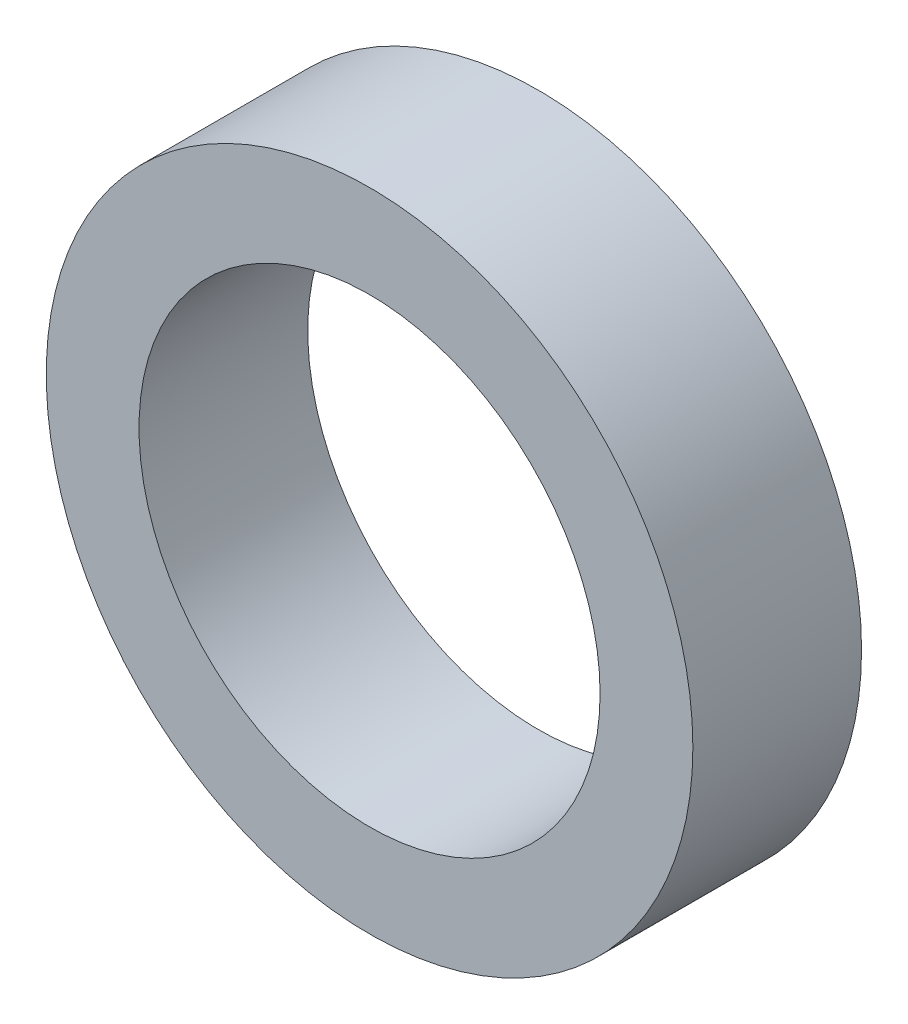
ISO-10303-21;
HEADER;
FILE_DESCRIPTION(('STEP AP214'),'2;1');
FILE_NAME('part.step','',(''),(''),'','','');
FILE_SCHEMA(('AUTOMOTIVE_DESIGN { 1 0 10303 214 1 1 1 1 }'));
ENDSEC;
DATA;
#1=APPLICATION_CONTEXT('core data for automotive mechanical design processes');
#2=APPLICATION_PROTOCOL_DEFINITION('international standard','automotive_design',2000,#1);
#3=PRODUCT_CONTEXT('',#1,'mechanical');
#4=PRODUCT('Part','Part','',(#3));
#5=PRODUCT_RELATED_PRODUCT_CATEGORY('part','',(#4));
#6=PRODUCT_DEFINITION_FORMATION('','',#4);
#7=PRODUCT_DEFINITION_CONTEXT('part definition',#1,'design');
#8=PRODUCT_DEFINITION('design','',#6,#7);
#9=PRODUCT_DEFINITION_SHAPE('','',#8);
#10=(LENGTH_UNIT() NAMED_UNIT(*) SI_UNIT(.MILLI.,.METRE.));
#11=(NAMED_UNIT(*) PLANE_ANGLE_UNIT() SI_UNIT($,.RADIAN.));
#12=(NAMED_UNIT(*) SI_UNIT($,.STERADIAN.) SOLID_ANGLE_UNIT());
#13=UNCERTAINTY_MEASURE_WITH_UNIT(LENGTH_MEASURE(1.E-05),#10,'distance_accuracy_value','');
#14=(GEOMETRIC_REPRESENTATION_CONTEXT(3) GLOBAL_UNCERTAINTY_ASSIGNED_CONTEXT((#13)) GLOBAL_UNIT_ASSIGNED_CONTEXT((#10,
#11,#12)) REPRESENTATION_CONTEXT('',''));
#15=CARTESIAN_POINT('',(0.,0.,0.));
#16=DIRECTION('',(0.,0.,1.));
#17=DIRECTION('',(1.,0.,0.));
#18=AXIS2_PLACEMENT_3D('',#15,#16,#17);
#19=CARTESIAN_POINT('',(0.,0.,3.));
#20=DIRECTION('',(0.,0.,1.));
#21=DIRECTION('',(1.,0.,0.));
#22=AXIS2_PLACEMENT_3D('',#19,#20,#21);
#23=PLANE('',#22);
#24=CARTESIAN_POINT('',(0.,0.,3.));
#25=DIRECTION('',(0.,0.,1.));
#26=DIRECTION('',(1.,0.,0.));
#27=AXIS2_PLACEMENT_3D('',#24,#25,#26);
#28=CIRCLE('',#27,5.75);
#29=CARTESIAN_POINT('',(5.75,0.,3.));
#30=VERTEX_POINT('',#29);
#31=EDGE_CURVE('E10',#30,#30,#28,.T.);
#32=ORIENTED_EDGE('',*,*,#31,.T.);
#33=EDGE_LOOP('',(#32));
#34=FACE_BOUND('',#33,.T.);
#35=CARTESIAN_POINT('',(0.,0.,3.));
#36=DIRECTION('',(0.,0.,1.));
#37=DIRECTION('',(1.,0.,0.));
#38=AXIS2_PLACEMENT_3D('',#35,#36,#37);
#39=CIRCLE('',#38,4.1);
#40=CARTESIAN_POINT('',(4.1,0.,3.));
#41=VERTEX_POINT('',#40);
#42=EDGE_CURVE('E50',#41,#41,#39,.T.);
#43=ORIENTED_EDGE('',*,*,#42,.F.);
#44=EDGE_LOOP('',(#43));
#45=FACE_BOUND('',#44,.T.);
#46=ADVANCED_FACE('F37',(#34,#45),#23,.T.);
#47=CARTESIAN_POINT('',(0.,0.,0.));
#48=DIRECTION('',(0.,0.,1.));
#49=DIRECTION('',(1.,0.,0.));
#50=AXIS2_PLACEMENT_3D('',#47,#48,#49);
#51=PLANE('',#50);
#52=CARTESIAN_POINT('',(0.,0.,0.));
#53=DIRECTION('',(0.,0.,1.));
#54=DIRECTION('',(1.,0.,0.));
#55=AXIS2_PLACEMENT_3D('',#52,#53,#54);
#56=CIRCLE('',#55,5.75);
#57=CARTESIAN_POINT('',(5.75,0.,0.));
#58=VERTEX_POINT('',#57);
#59=EDGE_CURVE('E41',#58,#58,#56,.T.);
#60=ORIENTED_EDGE('',*,*,#59,.F.);
#61=EDGE_LOOP('',(#60));
#62=FACE_BOUND('',#61,.T.);
#63=CARTESIAN_POINT('',(0.,0.,0.));
#64=DIRECTION('',(0.,0.,1.));
#65=DIRECTION('',(1.,0.,0.));
#66=AXIS2_PLACEMENT_3D('',#63,#64,#65);
#67=CIRCLE('',#66,4.1);
#68=CARTESIAN_POINT('',(4.1,0.,0.));
#69=VERTEX_POINT('',#68);
#70=EDGE_CURVE('E52',#69,#69,#67,.T.);
#71=ORIENTED_EDGE('',*,*,#70,.T.);
#72=EDGE_LOOP('',(#71));
#73=FACE_BOUND('',#72,.T.);
#74=ADVANCED_FACE('F64',(#62,#73),#51,.F.);
#75=CARTESIAN_POINT('',(0.,0.,3.));
#76=DIRECTION('',(0.,0.,-1.));
#77=DIRECTION('',(-1.,0.,0.));
#78=AXIS2_PLACEMENT_3D('',#75,#76,#77);
#79=CYLINDRICAL_SURFACE('',#78,5.75);
#80=ORIENTED_EDGE('',*,*,#31,.F.);
#81=EDGE_LOOP('',(#80));
#82=FACE_BOUND('',#81,.T.);
#83=ORIENTED_EDGE('',*,*,#59,.T.);
#84=EDGE_LOOP('',(#83));
#85=FACE_BOUND('',#84,.T.);
#86=ADVANCED_FACE('F39',(#82,#85),#79,.T.);
#87=CARTESIAN_POINT('',(0.,0.,3.));
#88=DIRECTION('',(0.,0.,-1.));
#89=DIRECTION('',(-1.,0.,0.));
#90=AXIS2_PLACEMENT_3D('',#87,#88,#89);
#91=CYLINDRICAL_SURFACE('',#90,4.1);
#92=ORIENTED_EDGE('',*,*,#42,.T.);
#93=EDGE_LOOP('',(#92));
#94=FACE_BOUND('',#93,.T.);
#95=ORIENTED_EDGE('',*,*,#70,.F.);
#96=EDGE_LOOP('',(#95));
#97=FACE_BOUND('',#96,.T.);
#98=ADVANCED_FACE('F60',(#94,#97),#91,.F.);
#99=CLOSED_SHELL('',(#46,#74,#86,#98));
#100=MANIFOLD_SOLID_BREP('B2',#99);
#101=ADVANCED_BREP_SHAPE_REPRESENTATION('',(#18,#100),#14);
#102=SHAPE_DEFINITION_REPRESENTATION(#9,#101);
ENDSEC;
END-ISO-10303-21;
